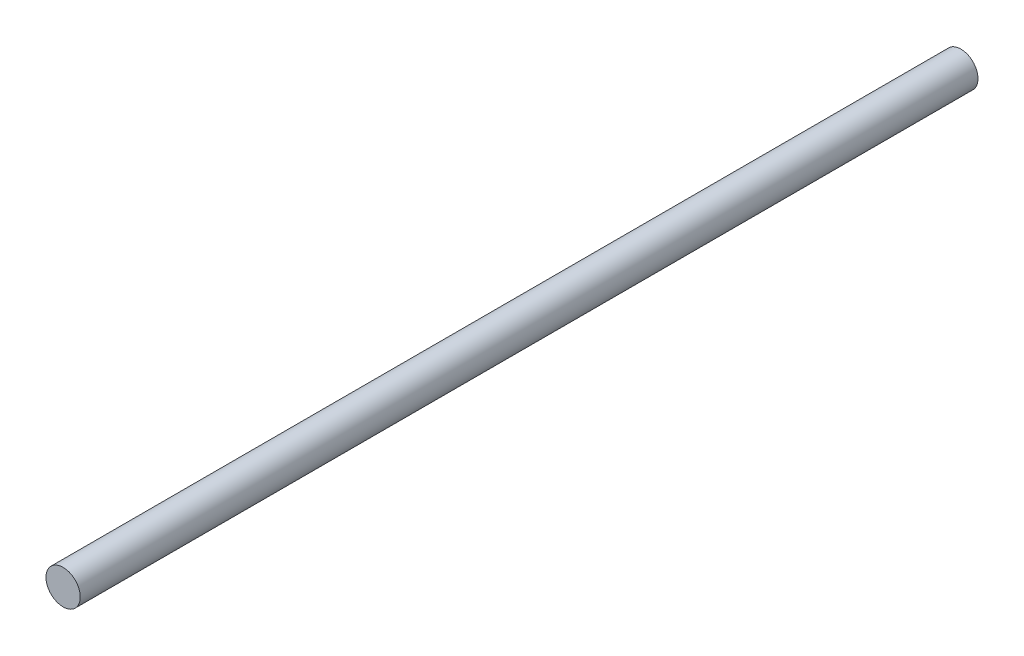
ISO-10303-21;
HEADER;
FILE_DESCRIPTION(('STEP AP214'),'2;1');
FILE_NAME('part.step','',(''),(''),'','','');
FILE_SCHEMA(('AUTOMOTIVE_DESIGN { 1 0 10303 214 1 1 1 1 }'));
ENDSEC;
DATA;
#1=APPLICATION_CONTEXT('core data for automotive mechanical design processes');
#2=APPLICATION_PROTOCOL_DEFINITION('international standard','automotive_design',2000,#1);
#3=PRODUCT_CONTEXT('',#1,'mechanical');
#4=PRODUCT('Part','Part','',(#3));
#5=PRODUCT_RELATED_PRODUCT_CATEGORY('part','',(#4));
#6=PRODUCT_DEFINITION_FORMATION('','',#4);
#7=PRODUCT_DEFINITION_CONTEXT('part definition',#1,'design');
#8=PRODUCT_DEFINITION('design','',#6,#7);
#9=PRODUCT_DEFINITION_SHAPE('','',#8);
#10=(LENGTH_UNIT() NAMED_UNIT(*) SI_UNIT(.MILLI.,.METRE.));
#11=(NAMED_UNIT(*) PLANE_ANGLE_UNIT() SI_UNIT($,.RADIAN.));
#12=(NAMED_UNIT(*) SI_UNIT($,.STERADIAN.) SOLID_ANGLE_UNIT());
#13=UNCERTAINTY_MEASURE_WITH_UNIT(LENGTH_MEASURE(1.E-05),#10,'distance_accuracy_value','');
#14=(GEOMETRIC_REPRESENTATION_CONTEXT(3) GLOBAL_UNCERTAINTY_ASSIGNED_CONTEXT((#13)) GLOBAL_UNIT_ASSIGNED_CONTEXT((#10,
#11,#12)) REPRESENTATION_CONTEXT('',''));
#15=CARTESIAN_POINT('',(0.,0.,0.));
#16=DIRECTION('',(0.,0.,1.));
#17=DIRECTION('',(1.,0.,0.));
#18=AXIS2_PLACEMENT_3D('',#15,#16,#17);
#19=CARTESIAN_POINT('',(0.,0.,33.));
#20=DIRECTION('',(0.,0.,-1.));
#21=DIRECTION('',(-1.,0.,0.));
#22=AXIS2_PLACEMENT_3D('',#19,#20,#21);
#23=CYLINDRICAL_SURFACE('',#22,0.63);
#24=CARTESIAN_POINT('',(0.,0.,33.));
#25=DIRECTION('',(0.,0.,1.));
#26=DIRECTION('',(1.,0.,0.));
#27=AXIS2_PLACEMENT_3D('',#24,#25,#26);
#28=CIRCLE('',#27,0.63);
#29=CARTESIAN_POINT('',(0.63,0.,33.));
#30=VERTEX_POINT('',#29);
#31=EDGE_CURVE('E10',#30,#30,#28,.T.);
#32=ORIENTED_EDGE('',*,*,#31,.F.);
#33=EDGE_LOOP('',(#32));
#34=FACE_BOUND('',#33,.T.);
#35=CARTESIAN_POINT('',(0.,0.,0.));
#36=DIRECTION('',(0.,0.,1.));
#37=DIRECTION('',(1.,0.,0.));
#38=AXIS2_PLACEMENT_3D('',#35,#36,#37);
#39=CIRCLE('',#38,0.63);
#40=CARTESIAN_POINT('',(0.63,0.,0.));
#41=VERTEX_POINT('',#40);
#42=EDGE_CURVE('E36',#41,#41,#39,.T.);
#43=ORIENTED_EDGE('',*,*,#42,.T.);
#44=EDGE_LOOP('',(#43));
#45=FACE_BOUND('',#44,.T.);
#46=ADVANCED_FACE('F33',(#34,#45),#23,.T.);
#47=CARTESIAN_POINT('',(0.,0.,33.));
#48=DIRECTION('',(0.,0.,1.));
#49=DIRECTION('',(1.,0.,0.));
#50=AXIS2_PLACEMENT_3D('',#47,#48,#49);
#51=PLANE('',#50);
#52=ORIENTED_EDGE('',*,*,#31,.T.);
#53=EDGE_LOOP('',(#52));
#54=FACE_BOUND('',#53,.T.);
#55=ADVANCED_FACE('F48',(#54),#51,.T.);
#56=CARTESIAN_POINT('',(0.,0.,0.));
#57=DIRECTION('',(0.,0.,1.));
#58=DIRECTION('',(1.,0.,0.));
#59=AXIS2_PLACEMENT_3D('',#56,#57,#58);
#60=PLANE('',#59);
#61=ORIENTED_EDGE('',*,*,#42,.F.);
#62=EDGE_LOOP('',(#61));
#63=FACE_BOUND('',#62,.T.);
#64=ADVANCED_FACE('F46',(#63),#60,.F.);
#65=CLOSED_SHELL('',(#46,#55,#64));
#66=MANIFOLD_SOLID_BREP('B2',#65);
#67=ADVANCED_BREP_SHAPE_REPRESENTATION('',(#18,#66),#14);
#68=SHAPE_DEFINITION_REPRESENTATION(#9,#67);
ENDSEC;
END-ISO-10303-21;
